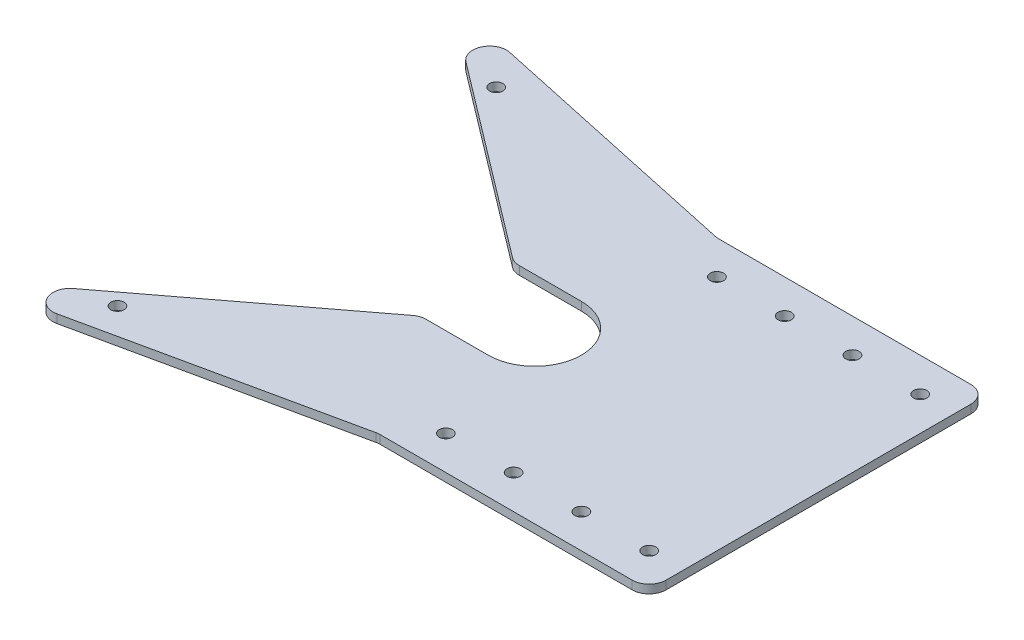
ISO-10303-21;
HEADER;
FILE_DESCRIPTION(('STEP AP214'),'2;1');
FILE_NAME('part.step','',(''),(''),'','','');
FILE_SCHEMA(('AUTOMOTIVE_DESIGN { 1 0 10303 214 1 1 1 1 }'));
ENDSEC;
DATA;
#1=APPLICATION_CONTEXT('core data for automotive mechanical design processes');
#2=APPLICATION_PROTOCOL_DEFINITION('international standard','automotive_design',2000,#1);
#3=PRODUCT_CONTEXT('',#1,'mechanical');
#4=PRODUCT('Part','Part','',(#3));
#5=PRODUCT_RELATED_PRODUCT_CATEGORY('part','',(#4));
#6=PRODUCT_DEFINITION_FORMATION('','',#4);
#7=PRODUCT_DEFINITION_CONTEXT('part definition',#1,'design');
#8=PRODUCT_DEFINITION('design','',#6,#7);
#9=PRODUCT_DEFINITION_SHAPE('','',#8);
#10=(LENGTH_UNIT() NAMED_UNIT(*) SI_UNIT(.MILLI.,.METRE.));
#11=(NAMED_UNIT(*) PLANE_ANGLE_UNIT() SI_UNIT($,.RADIAN.));
#12=(NAMED_UNIT(*) SI_UNIT($,.STERADIAN.) SOLID_ANGLE_UNIT());
#13=UNCERTAINTY_MEASURE_WITH_UNIT(LENGTH_MEASURE(1.E-05),#10,'distance_accuracy_value','');
#14=(GEOMETRIC_REPRESENTATION_CONTEXT(3) GLOBAL_UNCERTAINTY_ASSIGNED_CONTEXT((#13)) GLOBAL_UNIT_ASSIGNED_CONTEXT((#10,
#11,#12)) REPRESENTATION_CONTEXT('',''));
#15=CARTESIAN_POINT('',(0.,0.,0.));
#16=DIRECTION('',(0.,0.,1.));
#17=DIRECTION('',(1.,0.,0.));
#18=AXIS2_PLACEMENT_3D('',#15,#16,#17);
#19=CARTESIAN_POINT('',(-62.8226534491491,3.175,-133.35000000001));
#20=DIRECTION('',(0.,1.,0.));
#21=DIRECTION('',(0.,0.,1.));
#22=AXIS2_PLACEMENT_3D('',#19,#20,#21);
#23=PLANE('',#22);
#24=CARTESIAN_POINT('',(0.,3.175,-114.300000000012));
#25=DIRECTION('',(0.,1.,0.));
#26=DIRECTION('',(0.,0.,1.));
#27=AXIS2_PLACEMENT_3D('',#24,#25,#26);
#28=CIRCLE('',#27,2.48920000000326);
#29=CARTESIAN_POINT('',(0.,3.175,-111.810800000009));
#30=VERTEX_POINT('',#29);
#31=EDGE_CURVE('E403',#30,#30,#28,.T.);
#32=ORIENTED_EDGE('',*,*,#31,.F.);
#33=EDGE_LOOP('',(#32));
#34=FACE_BOUND('',#33,.T.);
#35=CARTESIAN_POINT('',(25.3999999999999,3.175,-12.7000000000122));
#36=DIRECTION('',(0.,1.,0.));
#37=DIRECTION('',(0.,0.,1.));
#38=AXIS2_PLACEMENT_3D('',#35,#36,#37);
#39=CIRCLE('',#38,2.4892);
#40=CARTESIAN_POINT('',(25.3999999999999,3.175,-10.2108000000122));
#41=VERTEX_POINT('',#40);
#42=EDGE_CURVE('E415',#41,#41,#39,.T.);
#43=ORIENTED_EDGE('',*,*,#42,.F.);
#44=EDGE_LOOP('',(#43));
#45=FACE_BOUND('',#44,.T.);
#46=CARTESIAN_POINT('',(-25.4000000000001,3.175,-12.7000000000122));
#47=DIRECTION('',(0.,1.,0.));
#48=DIRECTION('',(0.,0.,1.));
#49=AXIS2_PLACEMENT_3D('',#46,#47,#48);
#50=CIRCLE('',#49,2.4892);
#51=CARTESIAN_POINT('',(-25.4000000000001,3.175,-10.2108000000122));
#52=VERTEX_POINT('',#51);
#53=EDGE_CURVE('E427',#52,#52,#50,.T.);
#54=ORIENTED_EDGE('',*,*,#53,.F.);
#55=EDGE_LOOP('',(#54));
#56=FACE_BOUND('',#55,.T.);
#57=CARTESIAN_POINT('',(-50.8000000000001,3.175,-12.7000000000122));
#58=DIRECTION('',(0.,1.,0.));
#59=DIRECTION('',(0.,0.,1.));
#60=AXIS2_PLACEMENT_3D('',#57,#58,#59);
#61=CIRCLE('',#60,2.48919999999643);
#62=CARTESIAN_POINT('',(-50.8000000000001,3.175,-10.2108000000158));
#63=VERTEX_POINT('',#62);
#64=EDGE_CURVE('E439',#63,#63,#61,.T.);
#65=ORIENTED_EDGE('',*,*,#64,.F.);
#66=EDGE_LOOP('',(#65));
#67=FACE_BOUND('',#66,.T.);
#68=CARTESIAN_POINT('',(-153.721960951708,3.175,7.4822889917496));
#69=DIRECTION('',(0.,1.,0.));
#70=DIRECTION('',(0.,0.,1.));
#71=AXIS2_PLACEMENT_3D('',#68,#69,#70);
#72=CIRCLE('',#71,2.48920000000251);
#73=CARTESIAN_POINT('',(-153.721960951708,3.175,9.97148899175212));
#74=VERTEX_POINT('',#73);
#75=EDGE_CURVE('E204',#74,#74,#72,.T.);
#76=ORIENTED_EDGE('',*,*,#75,.F.);
#77=EDGE_LOOP('',(#76));
#78=FACE_BOUND('',#77,.T.);
#79=CARTESIAN_POINT('',(-62.8226534491491,3.175,-133.35000000001));
#80=DIRECTION('',(0.,-1.,0.));
#81=DIRECTION('',(0.,0.,1.));
#82=AXIS2_PLACEMENT_3D('',#79,#80,#81);
#83=CIRCLE('',#82,6.34999999999883);
#84=CARTESIAN_POINT('',(-62.8226534491471,3.175,-127.000000000012));
#85=VERTEX_POINT('',#84);
#86=CARTESIAN_POINT('',(-64.162105963014,3.175,-127.142877722893));
#87=VERTEX_POINT('',#86);
#88=EDGE_CURVE('E235',#85,#87,#83,.T.);
#89=ORIENTED_EDGE('',*,*,#88,.T.);
#90=DIRECTION('',(-0.977499571199766,0.,-0.210937403758255));
#91=VECTOR('',#90,1.);
#92=CARTESIAN_POINT('',(-64.162105963014,3.175,-127.142877722893));
#93=LINE('',#92,#91);
#94=CARTESIAN_POINT('',(-162.501480761333,3.175,-148.363810210574));
#95=VERTEX_POINT('',#94);
#96=EDGE_CURVE('E133',#87,#95,#93,.T.);
#97=ORIENTED_EDGE('',*,*,#96,.T.);
#98=CARTESIAN_POINT('',(-163.840933275197,3.175,-142.156687933455));
#99=DIRECTION('',(0.,1.,0.));
#100=DIRECTION('',(0.,0.,1.));
#101=AXIS2_PLACEMENT_3D('',#98,#99,#100);
#102=CIRCLE('',#101,6.35000000000025);
#103=CARTESIAN_POINT('',(-167.678132746048,3.175,-137.097201771708));
#104=VERTEX_POINT('',#103);
#105=EDGE_CURVE('E280',#95,#104,#102,.T.);
#106=ORIENTED_EDGE('',*,*,#105,.T.);
#107=DIRECTION('',(0.796769474290929,0.,0.604283381236119));
#108=VECTOR('',#107,1.);
#109=CARTESIAN_POINT('',(-167.678132746048,3.175,-137.097201771708));
#110=LINE('',#109,#108);
#111=CARTESIAN_POINT('',(-95.3640891292027,3.175,-82.2530138382641));
#112=VERTEX_POINT('',#111);
#113=EDGE_CURVE('E299',#104,#112,#110,.T.);
#114=ORIENTED_EDGE('',*,*,#113,.T.);
#115=CARTESIAN_POINT('',(-91.5268896583537,3.175,-87.3125000000104));
#116=DIRECTION('',(0.,1.,0.));
#117=DIRECTION('',(0.,0.,1.));
#118=AXIS2_PLACEMENT_3D('',#115,#116,#117);
#119=CIRCLE('',#118,6.3499999999989);
#120=CARTESIAN_POINT('',(-91.5268896583537,3.175,-80.9625000000115));
#121=VERTEX_POINT('',#120);
#122=EDGE_CURVE('E296',#112,#121,#119,.T.);
#123=ORIENTED_EDGE('',*,*,#122,.T.);
#124=DIRECTION('',(1.,0.,0.));
#125=VECTOR('',#124,1.);
#126=CARTESIAN_POINT('',(-68.2625000000001,3.175,-80.9625000000104));
#127=LINE('',#126,#125);
#128=CARTESIAN_POINT('',(-68.2625000000001,3.175,-80.9625000000104));
#129=VERTEX_POINT('',#128);
#130=EDGE_CURVE('E298',#121,#129,#127,.T.);
#131=ORIENTED_EDGE('',*,*,#130,.T.);
#132=CARTESIAN_POINT('',(-68.2625,3.175,-63.5000000000104));
#133=DIRECTION('',(0.,-1.,0.));
#134=DIRECTION('',(0.,0.,1.));
#135=AXIS2_PLACEMENT_3D('',#132,#133,#134);
#136=CIRCLE('',#135,17.4625);
#137=CARTESIAN_POINT('',(-68.2625000000001,3.175,-46.0375000000104));
#138=VERTEX_POINT('',#137);
#139=EDGE_CURVE('E301',#129,#138,#136,.T.);
#140=ORIENTED_EDGE('',*,*,#139,.T.);
#141=DIRECTION('',(-1.,0.,0.));
#142=VECTOR('',#141,1.);
#143=CARTESIAN_POINT('',(-68.2625000000001,3.175,-46.0375000000104));
#144=LINE('',#143,#142);
#145=CARTESIAN_POINT('',(-91.5268896583538,3.175,-46.0375000000104));
#146=VERTEX_POINT('',#145);
#147=EDGE_CURVE('E307',#138,#146,#144,.T.);
#148=ORIENTED_EDGE('',*,*,#147,.T.);
#149=CARTESIAN_POINT('',(-91.5268896583538,3.175,-39.6875000000104));
#150=DIRECTION('',(0.,1.,0.));
#151=DIRECTION('',(0.,0.,1.));
#152=AXIS2_PLACEMENT_3D('',#149,#150,#151);
#153=CIRCLE('',#152,6.35);
#154=CARTESIAN_POINT('',(-95.3640891292053,3.175,-44.7469861617562));
#155=VERTEX_POINT('',#154);
#156=EDGE_CURVE('E309',#146,#155,#153,.T.);
#157=ORIENTED_EDGE('',*,*,#156,.T.);
#158=DIRECTION('',(-0.796769474290676,0.,0.604283381236453));
#159=VECTOR('',#158,1.);
#160=CARTESIAN_POINT('',(-167.678132746045,3.175,10.097201771732));
#161=LINE('',#160,#159);
#162=CARTESIAN_POINT('',(-167.678132746045,3.175,10.097201771732));
#163=VERTEX_POINT('',#162);
#164=EDGE_CURVE('E311',#155,#163,#161,.T.);
#165=ORIENTED_EDGE('',*,*,#164,.T.);
#166=CARTESIAN_POINT('',(-163.840933275194,3.175,15.1566879334778));
#167=DIRECTION('',(0.,1.,0.));
#168=DIRECTION('',(0.,0.,1.));
#169=AXIS2_PLACEMENT_3D('',#166,#167,#168);
#170=CIRCLE('',#169,6.35);
#171=CARTESIAN_POINT('',(-162.501480761326,3.175,21.3638102105957));
#172=VERTEX_POINT('',#171);
#173=EDGE_CURVE('E313',#163,#172,#170,.T.);
#174=ORIENTED_EDGE('',*,*,#173,.T.);
#175=DIRECTION('',(0.977499571199678,0.,-0.210937403758664));
#176=VECTOR('',#175,1.);
#177=CARTESIAN_POINT('',(-64.1621059630072,3.175,0.142877722871665));
#178=LINE('',#177,#176);
#179=CARTESIAN_POINT('',(-64.1621059630072,3.175,0.142877722871665));
#180=VERTEX_POINT('',#179);
#181=EDGE_CURVE('E315',#172,#180,#178,.T.);
#182=ORIENTED_EDGE('',*,*,#181,.T.);
#183=CARTESIAN_POINT('',(-62.8226534491397,3.175,6.34999999998962));
#184=DIRECTION('',(0.,-1.,0.));
#185=DIRECTION('',(0.,0.,1.));
#186=AXIS2_PLACEMENT_3D('',#183,#184,#185);
#187=CIRCLE('',#186,6.35);
#188=CARTESIAN_POINT('',(-62.8226534491397,3.175,-1.03814526419832E-11));
#189=VERTEX_POINT('',#188);
#190=EDGE_CURVE('E317',#180,#189,#187,.T.);
#191=ORIENTED_EDGE('',*,*,#190,.T.);
#192=DIRECTION('',(1.,0.,0.));
#193=VECTOR('',#192,1.);
#194=CARTESIAN_POINT('',(31.7499999999999,3.175,-1.22462803786583E-11));
#195=LINE('',#194,#193);
#196=CARTESIAN_POINT('',(31.7499999999999,3.175,-1.22462803786583E-11));
#197=VERTEX_POINT('',#196);
#198=EDGE_CURVE('E319',#189,#197,#195,.T.);
#199=ORIENTED_EDGE('',*,*,#198,.T.);
#200=CARTESIAN_POINT('',(31.7499999999999,3.175,-6.35000000001225));
#201=DIRECTION('',(0.,1.,0.));
#202=DIRECTION('',(0.,0.,1.));
#203=AXIS2_PLACEMENT_3D('',#200,#201,#202);
#204=CIRCLE('',#203,6.35);
#205=CARTESIAN_POINT('',(38.0999999999999,3.175,-6.35000000001225));
#206=VERTEX_POINT('',#205);
#207=EDGE_CURVE('E182',#197,#206,#204,.T.);
#208=ORIENTED_EDGE('',*,*,#207,.T.);
#209=DIRECTION('',(0.,0.,-1.));
#210=VECTOR('',#209,1.);
#211=CARTESIAN_POINT('',(38.0999999999999,3.175,-6.35000000001225));
#212=LINE('',#211,#210);
#213=CARTESIAN_POINT('',(38.0999999999999,3.175,-120.650000000012));
#214=VERTEX_POINT('',#213);
#215=EDGE_CURVE('E176',#206,#214,#212,.T.);
#216=ORIENTED_EDGE('',*,*,#215,.T.);
#217=CARTESIAN_POINT('',(31.7499999999999,3.175,-120.650000000012));
#218=DIRECTION('',(0.,1.,0.));
#219=DIRECTION('',(0.,0.,1.));
#220=AXIS2_PLACEMENT_3D('',#217,#218,#219);
#221=CIRCLE('',#220,6.35);
#222=CARTESIAN_POINT('',(31.7499999999999,3.175,-127.000000000012));
#223=VERTEX_POINT('',#222);
#224=EDGE_CURVE('E180',#214,#223,#221,.T.);
#225=ORIENTED_EDGE('',*,*,#224,.T.);
#226=DIRECTION('',(-1.,0.,0.));
#227=VECTOR('',#226,1.);
#228=CARTESIAN_POINT('',(31.7499999999999,3.175,-127.000000000012));
#229=LINE('',#228,#227);
#230=EDGE_CURVE('E60',#223,#85,#229,.T.);
#231=ORIENTED_EDGE('',*,*,#230,.T.);
#232=EDGE_LOOP('',(#89,#97,#106,#114,#123,#131,#140,#148,#157,#165,#174,#182,#191,#199,#208,
#216,#225,#231));
#233=FACE_BOUND('',#232,.T.);
#234=CARTESIAN_POINT('',(-153.721960951708,3.175,-134.48228899175));
#235=DIRECTION('',(0.,1.,0.));
#236=DIRECTION('',(0.,0.,1.));
#237=AXIS2_PLACEMENT_3D('',#234,#235,#236);
#238=CIRCLE('',#237,2.48920000000588);
#239=CARTESIAN_POINT('',(-153.721960951708,3.175,-131.993088991744));
#240=VERTEX_POINT('',#239);
#241=EDGE_CURVE('E445',#240,#240,#238,.T.);
#242=ORIENTED_EDGE('',*,*,#241,.F.);
#243=EDGE_LOOP('',(#242));
#244=FACE_BOUND('',#243,.T.);
#245=CARTESIAN_POINT('',(-50.8000000000001,3.175,-114.300000000012));
#246=DIRECTION('',(0.,1.,0.));
#247=DIRECTION('',(0.,0.,1.));
#248=AXIS2_PLACEMENT_3D('',#245,#246,#247);
#249=CIRCLE('',#248,2.48919999999644);
#250=CARTESIAN_POINT('',(-50.8000000000001,3.175,-111.810800000016));
#251=VERTEX_POINT('',#250);
#252=EDGE_CURVE('E433',#251,#251,#249,.T.);
#253=ORIENTED_EDGE('',*,*,#252,.F.);
#254=EDGE_LOOP('',(#253));
#255=FACE_BOUND('',#254,.T.);
#256=CARTESIAN_POINT('',(0.,3.175,-12.7000000000122));
#257=DIRECTION('',(0.,1.,0.));
#258=DIRECTION('',(0.,0.,1.));
#259=AXIS2_PLACEMENT_3D('',#256,#257,#258);
#260=CIRCLE('',#259,2.4892);
#261=CARTESIAN_POINT('',(0.,3.175,-10.2108000000122));
#262=VERTEX_POINT('',#261);
#263=EDGE_CURVE('E421',#262,#262,#260,.T.);
#264=ORIENTED_EDGE('',*,*,#263,.F.);
#265=EDGE_LOOP('',(#264));
#266=FACE_BOUND('',#265,.T.);
#267=CARTESIAN_POINT('',(25.3999999999999,3.175,-114.300000000012));
#268=DIRECTION('',(0.,1.,0.));
#269=DIRECTION('',(0.,0.,1.));
#270=AXIS2_PLACEMENT_3D('',#267,#268,#269);
#271=CIRCLE('',#270,2.48920000000326);
#272=CARTESIAN_POINT('',(25.3999999999999,3.175,-111.810800000009));
#273=VERTEX_POINT('',#272);
#274=EDGE_CURVE('E409',#273,#273,#271,.T.);
#275=ORIENTED_EDGE('',*,*,#274,.F.);
#276=EDGE_LOOP('',(#275));
#277=FACE_BOUND('',#276,.T.);
#278=CARTESIAN_POINT('',(-25.4000000000001,3.175,-114.300000000012));
#279=DIRECTION('',(0.,1.,0.));
#280=DIRECTION('',(0.,0.,1.));
#281=AXIS2_PLACEMENT_3D('',#278,#279,#280);
#282=CIRCLE('',#281,2.48920000000326);
#283=CARTESIAN_POINT('',(-25.4000000000001,3.175,-111.810800000009));
#284=VERTEX_POINT('',#283);
#285=EDGE_CURVE('E394',#284,#284,#282,.T.);
#286=ORIENTED_EDGE('',*,*,#285,.F.);
#287=EDGE_LOOP('',(#286));
#288=FACE_BOUND('',#287,.T.);
#289=ADVANCED_FACE('F43',(#34,#45,#56,#67,#78,#233,#244,#255,#266,#277,#288),#23,.T.);
#290=CARTESIAN_POINT('',(-62.8226534491491,0.,-133.35000000001));
#291=DIRECTION('',(0.,1.,0.));
#292=DIRECTION('',(0.,0.,1.));
#293=AXIS2_PLACEMENT_3D('',#290,#291,#292);
#294=PLANE('',#293);
#295=CARTESIAN_POINT('',(-62.8226534491491,0.,-133.35000000001));
#296=DIRECTION('',(0.,-1.,0.));
#297=DIRECTION('',(0.,0.,1.));
#298=AXIS2_PLACEMENT_3D('',#295,#296,#297);
#299=CIRCLE('',#298,6.34999999999883);
#300=CARTESIAN_POINT('',(-62.8226534491471,0.,-127.000000000012));
#301=VERTEX_POINT('',#300);
#302=CARTESIAN_POINT('',(-64.162105963014,0.,-127.142877722893));
#303=VERTEX_POINT('',#302);
#304=EDGE_CURVE('E200',#301,#303,#299,.T.);
#305=ORIENTED_EDGE('',*,*,#304,.F.);
#306=DIRECTION('',(-1.,0.,0.));
#307=VECTOR('',#306,1.);
#308=CARTESIAN_POINT('',(31.7499999999999,0.,-127.000000000012));
#309=LINE('',#308,#307);
#310=CARTESIAN_POINT('',(31.7499999999999,0.,-127.000000000012));
#311=VERTEX_POINT('',#310);
#312=EDGE_CURVE('E125',#311,#301,#309,.T.);
#313=ORIENTED_EDGE('',*,*,#312,.F.);
#314=CARTESIAN_POINT('',(31.7499999999999,0.,-120.650000000012));
#315=DIRECTION('',(0.,1.,0.));
#316=DIRECTION('',(0.,0.,1.));
#317=AXIS2_PLACEMENT_3D('',#314,#315,#316);
#318=CIRCLE('',#317,6.35);
#319=CARTESIAN_POINT('',(38.0999999999999,0.,-120.650000000012));
#320=VERTEX_POINT('',#319);
#321=EDGE_CURVE('E119',#320,#311,#318,.T.);
#322=ORIENTED_EDGE('',*,*,#321,.F.);
#323=DIRECTION('',(0.,0.,-1.));
#324=VECTOR('',#323,1.);
#325=CARTESIAN_POINT('',(38.0999999999999,0.,-6.35000000001225));
#326=LINE('',#325,#324);
#327=CARTESIAN_POINT('',(38.0999999999999,0.,-6.35000000001225));
#328=VERTEX_POINT('',#327);
#329=EDGE_CURVE('E190',#328,#320,#326,.T.);
#330=ORIENTED_EDGE('',*,*,#329,.F.);
#331=CARTESIAN_POINT('',(31.7499999999999,0.,-6.35000000001225));
#332=DIRECTION('',(0.,1.,0.));
#333=DIRECTION('',(0.,0.,1.));
#334=AXIS2_PLACEMENT_3D('',#331,#332,#333);
#335=CIRCLE('',#334,6.35);
#336=CARTESIAN_POINT('',(31.7499999999999,0.,-1.22462803786583E-11));
#337=VERTEX_POINT('',#336);
#338=EDGE_CURVE('E230',#337,#328,#335,.T.);
#339=ORIENTED_EDGE('',*,*,#338,.F.);
#340=DIRECTION('',(1.,0.,0.));
#341=VECTOR('',#340,1.);
#342=CARTESIAN_POINT('',(31.7499999999999,0.,-1.22462803786583E-11));
#343=LINE('',#342,#341);
#344=CARTESIAN_POINT('',(-62.8226534491397,0.,-1.03814526419832E-11));
#345=VERTEX_POINT('',#344);
#346=EDGE_CURVE('E228',#345,#337,#343,.T.);
#347=ORIENTED_EDGE('',*,*,#346,.F.);
#348=CARTESIAN_POINT('',(-62.8226534491397,0.,6.34999999998962));
#349=DIRECTION('',(0.,-1.,0.));
#350=DIRECTION('',(0.,0.,1.));
#351=AXIS2_PLACEMENT_3D('',#348,#349,#350);
#352=CIRCLE('',#351,6.35);
#353=CARTESIAN_POINT('',(-64.1621059630072,0.,0.142877722871665));
#354=VERTEX_POINT('',#353);
#355=EDGE_CURVE('E226',#354,#345,#352,.T.);
#356=ORIENTED_EDGE('',*,*,#355,.F.);
#357=DIRECTION('',(0.977499571199678,0.,-0.210937403758664));
#358=VECTOR('',#357,1.);
#359=CARTESIAN_POINT('',(-64.1621059630072,0.,0.142877722871665));
#360=LINE('',#359,#358);
#361=CARTESIAN_POINT('',(-162.501480761326,0.,21.3638102105957));
#362=VERTEX_POINT('',#361);
#363=EDGE_CURVE('E224',#362,#354,#360,.T.);
#364=ORIENTED_EDGE('',*,*,#363,.F.);
#365=CARTESIAN_POINT('',(-163.840933275194,0.,15.1566879334778));
#366=DIRECTION('',(0.,1.,0.));
#367=DIRECTION('',(0.,0.,1.));
#368=AXIS2_PLACEMENT_3D('',#365,#366,#367);
#369=CIRCLE('',#368,6.35);
#370=CARTESIAN_POINT('',(-167.678132746045,0.,10.097201771732));
#371=VERTEX_POINT('',#370);
#372=EDGE_CURVE('E222',#371,#362,#369,.T.);
#373=ORIENTED_EDGE('',*,*,#372,.F.);
#374=DIRECTION('',(-0.796769474290676,0.,0.604283381236453));
#375=VECTOR('',#374,1.);
#376=CARTESIAN_POINT('',(-167.678132746045,0.,10.097201771732));
#377=LINE('',#376,#375);
#378=CARTESIAN_POINT('',(-95.3640891292053,0.,-44.7469861617562));
#379=VERTEX_POINT('',#378);
#380=EDGE_CURVE('E220',#379,#371,#377,.T.);
#381=ORIENTED_EDGE('',*,*,#380,.F.);
#382=CARTESIAN_POINT('',(-91.5268896583538,0.,-39.6875000000104));
#383=DIRECTION('',(0.,1.,0.));
#384=DIRECTION('',(0.,0.,1.));
#385=AXIS2_PLACEMENT_3D('',#382,#383,#384);
#386=CIRCLE('',#385,6.35);
#387=CARTESIAN_POINT('',(-91.5268896583538,0.,-46.0375000000104));
#388=VERTEX_POINT('',#387);
#389=EDGE_CURVE('E218',#388,#379,#386,.T.);
#390=ORIENTED_EDGE('',*,*,#389,.F.);
#391=DIRECTION('',(-1.,0.,0.));
#392=VECTOR('',#391,1.);
#393=CARTESIAN_POINT('',(-68.2625000000001,0.,-46.0375000000104));
#394=LINE('',#393,#392);
#395=CARTESIAN_POINT('',(-68.2625000000001,0.,-46.0375000000104));
#396=VERTEX_POINT('',#395);
#397=EDGE_CURVE('E216',#396,#388,#394,.T.);
#398=ORIENTED_EDGE('',*,*,#397,.F.);
#399=CARTESIAN_POINT('',(-68.2625,0.,-63.5000000000104));
#400=DIRECTION('',(0.,-1.,0.));
#401=DIRECTION('',(0.,0.,1.));
#402=AXIS2_PLACEMENT_3D('',#399,#400,#401);
#403=CIRCLE('',#402,17.4625);
#404=CARTESIAN_POINT('',(-68.2625000000001,0.,-80.9625000000104));
#405=VERTEX_POINT('',#404);
#406=EDGE_CURVE('E214',#405,#396,#403,.T.);
#407=ORIENTED_EDGE('',*,*,#406,.F.);
#408=DIRECTION('',(1.,0.,0.));
#409=VECTOR('',#408,1.);
#410=CARTESIAN_POINT('',(-68.2625000000001,0.,-80.9625000000104));
#411=LINE('',#410,#409);
#412=CARTESIAN_POINT('',(-91.5268896583537,0.,-80.9625000000115));
#413=VERTEX_POINT('',#412);
#414=EDGE_CURVE('E212',#413,#405,#411,.T.);
#415=ORIENTED_EDGE('',*,*,#414,.F.);
#416=CARTESIAN_POINT('',(-91.5268896583537,0.,-87.3125000000104));
#417=DIRECTION('',(0.,1.,0.));
#418=DIRECTION('',(0.,0.,1.));
#419=AXIS2_PLACEMENT_3D('',#416,#417,#418);
#420=CIRCLE('',#419,6.3499999999989);
#421=CARTESIAN_POINT('',(-95.3640891292027,0.,-82.2530138382641));
#422=VERTEX_POINT('',#421);
#423=EDGE_CURVE('E210',#422,#413,#420,.T.);
#424=ORIENTED_EDGE('',*,*,#423,.F.);
#425=DIRECTION('',(0.796769474290929,0.,0.604283381236119));
#426=VECTOR('',#425,1.);
#427=CARTESIAN_POINT('',(-167.678132746048,0.,-137.097201771708));
#428=LINE('',#427,#426);
#429=CARTESIAN_POINT('',(-167.678132746048,0.,-137.097201771708));
#430=VERTEX_POINT('',#429);
#431=EDGE_CURVE('E208',#430,#422,#428,.T.);
#432=ORIENTED_EDGE('',*,*,#431,.F.);
#433=CARTESIAN_POINT('',(-163.840933275197,0.,-142.156687933455));
#434=DIRECTION('',(0.,1.,0.));
#435=DIRECTION('',(0.,0.,1.));
#436=AXIS2_PLACEMENT_3D('',#433,#434,#435);
#437=CIRCLE('',#436,6.35000000000025);
#438=CARTESIAN_POINT('',(-162.501480761333,0.,-148.363810210574));
#439=VERTEX_POINT('',#438);
#440=EDGE_CURVE('E206',#439,#430,#437,.T.);
#441=ORIENTED_EDGE('',*,*,#440,.F.);
#442=DIRECTION('',(-0.977499571199766,0.,-0.210937403758255));
#443=VECTOR('',#442,1.);
#444=CARTESIAN_POINT('',(-64.162105963014,0.,-127.142877722893));
#445=LINE('',#444,#443);
#446=EDGE_CURVE('E203',#303,#439,#445,.T.);
#447=ORIENTED_EDGE('',*,*,#446,.F.);
#448=EDGE_LOOP('',(#305,#313,#322,#330,#339,#347,#356,#364,#373,#381,#390,#398,#407,#415,#424,
#432,#441,#447));
#449=FACE_BOUND('',#448,.T.);
#450=CARTESIAN_POINT('',(-153.721960951708,0.,7.4822889917496));
#451=DIRECTION('',(0.,1.,0.));
#452=DIRECTION('',(0.,0.,1.));
#453=AXIS2_PLACEMENT_3D('',#450,#451,#452);
#454=CIRCLE('',#453,2.48920000000251);
#455=CARTESIAN_POINT('',(-153.721960951708,0.,9.97148899175212));
#456=VERTEX_POINT('',#455);
#457=EDGE_CURVE('E448',#456,#456,#454,.T.);
#458=ORIENTED_EDGE('',*,*,#457,.T.);
#459=EDGE_LOOP('',(#458));
#460=FACE_BOUND('',#459,.T.);
#461=CARTESIAN_POINT('',(-153.721960951708,0.,-134.48228899175));
#462=DIRECTION('',(0.,1.,0.));
#463=DIRECTION('',(0.,0.,1.));
#464=AXIS2_PLACEMENT_3D('',#461,#462,#463);
#465=CIRCLE('',#464,2.48920000000588);
#466=CARTESIAN_POINT('',(-153.721960951708,0.,-131.993088991744));
#467=VERTEX_POINT('',#466);
#468=EDGE_CURVE('E442',#467,#467,#465,.T.);
#469=ORIENTED_EDGE('',*,*,#468,.T.);
#470=EDGE_LOOP('',(#469));
#471=FACE_BOUND('',#470,.T.);
#472=CARTESIAN_POINT('',(-50.8000000000001,0.,-12.7000000000122));
#473=DIRECTION('',(0.,1.,0.));
#474=DIRECTION('',(0.,0.,1.));
#475=AXIS2_PLACEMENT_3D('',#472,#473,#474);
#476=CIRCLE('',#475,2.48919999999643);
#477=CARTESIAN_POINT('',(-50.8000000000001,0.,-10.2108000000158));
#478=VERTEX_POINT('',#477);
#479=EDGE_CURVE('E436',#478,#478,#476,.T.);
#480=ORIENTED_EDGE('',*,*,#479,.T.);
#481=EDGE_LOOP('',(#480));
#482=FACE_BOUND('',#481,.T.);
#483=CARTESIAN_POINT('',(-50.8000000000001,0.,-114.300000000012));
#484=DIRECTION('',(0.,1.,0.));
#485=DIRECTION('',(0.,0.,1.));
#486=AXIS2_PLACEMENT_3D('',#483,#484,#485);
#487=CIRCLE('',#486,2.48919999999644);
#488=CARTESIAN_POINT('',(-50.8000000000001,0.,-111.810800000016));
#489=VERTEX_POINT('',#488);
#490=EDGE_CURVE('E430',#489,#489,#487,.T.);
#491=ORIENTED_EDGE('',*,*,#490,.T.);
#492=EDGE_LOOP('',(#491));
#493=FACE_BOUND('',#492,.T.);
#494=CARTESIAN_POINT('',(-25.4000000000001,0.,-12.7000000000122));
#495=DIRECTION('',(0.,1.,0.));
#496=DIRECTION('',(0.,0.,1.));
#497=AXIS2_PLACEMENT_3D('',#494,#495,#496);
#498=CIRCLE('',#497,2.4892);
#499=CARTESIAN_POINT('',(-25.4000000000001,0.,-10.2108000000122));
#500=VERTEX_POINT('',#499);
#501=EDGE_CURVE('E424',#500,#500,#498,.T.);
#502=ORIENTED_EDGE('',*,*,#501,.T.);
#503=EDGE_LOOP('',(#502));
#504=FACE_BOUND('',#503,.T.);
#505=CARTESIAN_POINT('',(0.,0.,-12.7000000000122));
#506=DIRECTION('',(0.,1.,0.));
#507=DIRECTION('',(0.,0.,1.));
#508=AXIS2_PLACEMENT_3D('',#505,#506,#507);
#509=CIRCLE('',#508,2.4892);
#510=CARTESIAN_POINT('',(0.,0.,-10.2108000000122));
#511=VERTEX_POINT('',#510);
#512=EDGE_CURVE('E418',#511,#511,#509,.T.);
#513=ORIENTED_EDGE('',*,*,#512,.T.);
#514=EDGE_LOOP('',(#513));
#515=FACE_BOUND('',#514,.T.);
#516=CARTESIAN_POINT('',(25.3999999999999,0.,-12.7000000000122));
#517=DIRECTION('',(0.,1.,0.));
#518=DIRECTION('',(0.,0.,1.));
#519=AXIS2_PLACEMENT_3D('',#516,#517,#518);
#520=CIRCLE('',#519,2.4892);
#521=CARTESIAN_POINT('',(25.3999999999999,0.,-10.2108000000122));
#522=VERTEX_POINT('',#521);
#523=EDGE_CURVE('E412',#522,#522,#520,.T.);
#524=ORIENTED_EDGE('',*,*,#523,.T.);
#525=EDGE_LOOP('',(#524));
#526=FACE_BOUND('',#525,.T.);
#527=CARTESIAN_POINT('',(25.3999999999999,0.,-114.300000000012));
#528=DIRECTION('',(0.,1.,0.));
#529=DIRECTION('',(0.,0.,1.));
#530=AXIS2_PLACEMENT_3D('',#527,#528,#529);
#531=CIRCLE('',#530,2.48920000000326);
#532=CARTESIAN_POINT('',(25.3999999999999,0.,-111.810800000009));
#533=VERTEX_POINT('',#532);
#534=EDGE_CURVE('E406',#533,#533,#531,.T.);
#535=ORIENTED_EDGE('',*,*,#534,.T.);
#536=EDGE_LOOP('',(#535));
#537=FACE_BOUND('',#536,.T.);
#538=CARTESIAN_POINT('',(0.,0.,-114.300000000012));
#539=DIRECTION('',(0.,1.,0.));
#540=DIRECTION('',(0.,0.,1.));
#541=AXIS2_PLACEMENT_3D('',#538,#539,#540);
#542=CIRCLE('',#541,2.48920000000326);
#543=CARTESIAN_POINT('',(0.,0.,-111.810800000009));
#544=VERTEX_POINT('',#543);
#545=EDGE_CURVE('E400',#544,#544,#542,.T.);
#546=ORIENTED_EDGE('',*,*,#545,.T.);
#547=EDGE_LOOP('',(#546));
#548=FACE_BOUND('',#547,.T.);
#549=CARTESIAN_POINT('',(-25.4000000000001,0.,-114.300000000012));
#550=DIRECTION('',(0.,1.,0.));
#551=DIRECTION('',(0.,0.,1.));
#552=AXIS2_PLACEMENT_3D('',#549,#550,#551);
#553=CIRCLE('',#552,2.48920000000326);
#554=CARTESIAN_POINT('',(-25.4000000000001,0.,-111.810800000009));
#555=VERTEX_POINT('',#554);
#556=EDGE_CURVE('E397',#555,#555,#553,.T.);
#557=ORIENTED_EDGE('',*,*,#556,.T.);
#558=EDGE_LOOP('',(#557));
#559=FACE_BOUND('',#558,.T.);
#560=ADVANCED_FACE('F284',(#449,#460,#471,#482,#493,#504,#515,#526,#537,#548,#559),#294,.F.);
#561=CARTESIAN_POINT('',(-62.8226534491491,3.175,-133.35000000001));
#562=DIRECTION('',(0.,-1.,0.));
#563=DIRECTION('',(0.,0.,-1.));
#564=AXIS2_PLACEMENT_3D('',#561,#562,#563);
#565=CYLINDRICAL_SURFACE('',#564,6.34999999999883);
#566=ORIENTED_EDGE('',*,*,#304,.T.);
#567=DIRECTION('',(0.,-1.,0.));
#568=VECTOR('',#567,1.);
#569=CARTESIAN_POINT('',(-64.162105963014,3.175,-127.142877722893));
#570=LINE('',#569,#568);
#571=EDGE_CURVE('E11',#87,#303,#570,.T.);
#572=ORIENTED_EDGE('',*,*,#571,.F.);
#573=ORIENTED_EDGE('',*,*,#88,.F.);
#574=DIRECTION('',(0.,-1.,0.));
#575=VECTOR('',#574,1.);
#576=CARTESIAN_POINT('',(-62.8226534491471,3.175,-127.000000000012));
#577=LINE('',#576,#575);
#578=EDGE_CURVE('E196',#85,#301,#577,.T.);
#579=ORIENTED_EDGE('',*,*,#578,.T.);
#580=EDGE_LOOP('',(#566,#572,#573,#579));
#581=FACE_BOUND('',#580,.T.);
#582=ADVANCED_FACE('F45',(#581),#565,.F.);
#583=CARTESIAN_POINT('',(-64.162105963014,3.175,-127.142877722893));
#584=DIRECTION('',(-0.210937403758255,0.,0.977499571199766));
#585=DIRECTION('',(0.977499571199766,0.,0.210937403758255));
#586=AXIS2_PLACEMENT_3D('',#583,#584,#585);
#587=PLANE('',#586);
#588=ORIENTED_EDGE('',*,*,#446,.T.);
#589=DIRECTION('',(0.,-1.,0.));
#590=VECTOR('',#589,1.);
#591=CARTESIAN_POINT('',(-162.501480761333,3.175,-148.363810210574));
#592=LINE('',#591,#590);
#593=EDGE_CURVE('E52',#95,#439,#592,.T.);
#594=ORIENTED_EDGE('',*,*,#593,.F.);
#595=ORIENTED_EDGE('',*,*,#96,.F.);
#596=ORIENTED_EDGE('',*,*,#571,.T.);
#597=EDGE_LOOP('',(#588,#594,#595,#596));
#598=FACE_BOUND('',#597,.T.);
#599=ADVANCED_FACE('F682',(#598),#587,.F.);
#600=CARTESIAN_POINT('',(-163.840933275197,3.175,-142.156687933455));
#601=DIRECTION('',(0.,-1.,0.));
#602=DIRECTION('',(0.,0.,-1.));
#603=AXIS2_PLACEMENT_3D('',#600,#601,#602);
#604=CYLINDRICAL_SURFACE('',#603,6.35000000000025);
#605=ORIENTED_EDGE('',*,*,#440,.T.);
#606=DIRECTION('',(0.,-1.,0.));
#607=VECTOR('',#606,1.);
#608=CARTESIAN_POINT('',(-167.678132746048,3.175,-137.097201771708));
#609=LINE('',#608,#607);
#610=EDGE_CURVE('E272',#104,#430,#609,.T.);
#611=ORIENTED_EDGE('',*,*,#610,.F.);
#612=ORIENTED_EDGE('',*,*,#105,.F.);
#613=ORIENTED_EDGE('',*,*,#593,.T.);
#614=EDGE_LOOP('',(#605,#611,#612,#613));
#615=FACE_BOUND('',#614,.T.);
#616=ADVANCED_FACE('F278',(#615),#604,.T.);
#617=CARTESIAN_POINT('',(-167.678132746048,3.175,-137.097201771708));
#618=DIRECTION('',(0.604283381236119,0.,-0.796769474290929));
#619=DIRECTION('',(-0.796769474290929,0.,-0.604283381236119));
#620=AXIS2_PLACEMENT_3D('',#617,#618,#619);
#621=PLANE('',#620);
#622=ORIENTED_EDGE('',*,*,#431,.T.);
#623=DIRECTION('',(0.,-1.,0.));
#624=VECTOR('',#623,1.);
#625=CARTESIAN_POINT('',(-95.3640891292027,3.175,-82.2530138382641));
#626=LINE('',#625,#624);
#627=EDGE_CURVE('E269',#112,#422,#626,.T.);
#628=ORIENTED_EDGE('',*,*,#627,.F.);
#629=ORIENTED_EDGE('',*,*,#113,.F.);
#630=ORIENTED_EDGE('',*,*,#610,.T.);
#631=EDGE_LOOP('',(#622,#628,#629,#630));
#632=FACE_BOUND('',#631,.T.);
#633=ADVANCED_FACE('F290',(#632),#621,.F.);
#634=CARTESIAN_POINT('',(-91.5268896583537,3.175,-87.3125000000104));
#635=DIRECTION('',(0.,-1.,0.));
#636=DIRECTION('',(0.,0.,-1.));
#637=AXIS2_PLACEMENT_3D('',#634,#635,#636);
#638=CYLINDRICAL_SURFACE('',#637,6.3499999999989);
#639=ORIENTED_EDGE('',*,*,#423,.T.);
#640=DIRECTION('',(0.,-1.,0.));
#641=VECTOR('',#640,1.);
#642=CARTESIAN_POINT('',(-91.5268896583537,3.175,-80.9625000000115));
#643=LINE('',#642,#641);
#644=EDGE_CURVE('E266',#121,#413,#643,.T.);
#645=ORIENTED_EDGE('',*,*,#644,.F.);
#646=ORIENTED_EDGE('',*,*,#122,.F.);
#647=ORIENTED_EDGE('',*,*,#627,.T.);
#648=EDGE_LOOP('',(#639,#645,#646,#647));
#649=FACE_BOUND('',#648,.T.);
#650=ADVANCED_FACE('F294',(#649),#638,.T.);
#651=CARTESIAN_POINT('',(-68.2625000000001,3.175,-80.9625000000104));
#652=DIRECTION('',(0.,0.,-1.));
#653=DIRECTION('',(-1.,0.,0.));
#654=AXIS2_PLACEMENT_3D('',#651,#652,#653);
#655=PLANE('',#654);
#656=ORIENTED_EDGE('',*,*,#414,.T.);
#657=DIRECTION('',(0.,-1.,0.));
#658=VECTOR('',#657,1.);
#659=CARTESIAN_POINT('',(-68.2625000000001,3.175,-80.9625000000104));
#660=LINE('',#659,#658);
#661=EDGE_CURVE('E263',#129,#405,#660,.T.);
#662=ORIENTED_EDGE('',*,*,#661,.F.);
#663=ORIENTED_EDGE('',*,*,#130,.F.);
#664=ORIENTED_EDGE('',*,*,#644,.T.);
#665=EDGE_LOOP('',(#656,#662,#663,#664));
#666=FACE_BOUND('',#665,.T.);
#667=ADVANCED_FACE('F647',(#666),#655,.F.);
#668=CARTESIAN_POINT('',(-68.2625,3.175,-63.5000000000104));
#669=DIRECTION('',(0.,-1.,0.));
#670=DIRECTION('',(0.,0.,-1.));
#671=AXIS2_PLACEMENT_3D('',#668,#669,#670);
#672=CYLINDRICAL_SURFACE('',#671,17.4625);
#673=ORIENTED_EDGE('',*,*,#406,.T.);
#674=DIRECTION('',(0.,-1.,0.));
#675=VECTOR('',#674,1.);
#676=CARTESIAN_POINT('',(-68.2625000000001,3.175,-46.0375000000104));
#677=LINE('',#676,#675);
#678=EDGE_CURVE('E260',#138,#396,#677,.T.);
#679=ORIENTED_EDGE('',*,*,#678,.F.);
#680=ORIENTED_EDGE('',*,*,#139,.F.);
#681=ORIENTED_EDGE('',*,*,#661,.T.);
#682=EDGE_LOOP('',(#673,#679,#680,#681));
#683=FACE_BOUND('',#682,.T.);
#684=ADVANCED_FACE('F637',(#683),#672,.F.);
#685=CARTESIAN_POINT('',(-68.2625000000001,3.175,-46.0375000000104));
#686=DIRECTION('',(0.,0.,1.));
#687=DIRECTION('',(1.,0.,0.));
#688=AXIS2_PLACEMENT_3D('',#685,#686,#687);
#689=PLANE('',#688);
#690=ORIENTED_EDGE('',*,*,#397,.T.);
#691=DIRECTION('',(0.,-1.,0.));
#692=VECTOR('',#691,1.);
#693=CARTESIAN_POINT('',(-91.5268896583538,3.175,-46.0375000000104));
#694=LINE('',#693,#692);
#695=EDGE_CURVE('E257',#146,#388,#694,.T.);
#696=ORIENTED_EDGE('',*,*,#695,.F.);
#697=ORIENTED_EDGE('',*,*,#147,.F.);
#698=ORIENTED_EDGE('',*,*,#678,.T.);
#699=EDGE_LOOP('',(#690,#696,#697,#698));
#700=FACE_BOUND('',#699,.T.);
#701=ADVANCED_FACE('F627',(#700),#689,.F.);
#702=CARTESIAN_POINT('',(-91.5268896583538,3.175,-39.6875000000104));
#703=DIRECTION('',(0.,-1.,0.));
#704=DIRECTION('',(0.,0.,-1.));
#705=AXIS2_PLACEMENT_3D('',#702,#703,#704);
#706=CYLINDRICAL_SURFACE('',#705,6.35);
#707=ORIENTED_EDGE('',*,*,#389,.T.);
#708=DIRECTION('',(0.,-1.,0.));
#709=VECTOR('',#708,1.);
#710=CARTESIAN_POINT('',(-95.3640891292053,3.175,-44.7469861617562));
#711=LINE('',#710,#709);
#712=EDGE_CURVE('E254',#155,#379,#711,.T.);
#713=ORIENTED_EDGE('',*,*,#712,.F.);
#714=ORIENTED_EDGE('',*,*,#156,.F.);
#715=ORIENTED_EDGE('',*,*,#695,.T.);
#716=EDGE_LOOP('',(#707,#713,#714,#715));
#717=FACE_BOUND('',#716,.T.);
#718=ADVANCED_FACE('F617',(#717),#706,.T.);
#719=CARTESIAN_POINT('',(-167.678132746045,3.175,10.097201771732));
#720=DIRECTION('',(0.604283381236453,0.,0.796769474290676));
#721=DIRECTION('',(0.796769474290676,0.,-0.604283381236453));
#722=AXIS2_PLACEMENT_3D('',#719,#720,#721);
#723=PLANE('',#722);
#724=ORIENTED_EDGE('',*,*,#380,.T.);
#725=DIRECTION('',(0.,-1.,0.));
#726=VECTOR('',#725,1.);
#727=CARTESIAN_POINT('',(-167.678132746045,3.175,10.097201771732));
#728=LINE('',#727,#726);
#729=EDGE_CURVE('E251',#163,#371,#728,.T.);
#730=ORIENTED_EDGE('',*,*,#729,.F.);
#731=ORIENTED_EDGE('',*,*,#164,.F.);
#732=ORIENTED_EDGE('',*,*,#712,.T.);
#733=EDGE_LOOP('',(#724,#730,#731,#732));
#734=FACE_BOUND('',#733,.T.);
#735=ADVANCED_FACE('F607',(#734),#723,.F.);
#736=CARTESIAN_POINT('',(-163.840933275194,3.175,15.1566879334778));
#737=DIRECTION('',(0.,-1.,0.));
#738=DIRECTION('',(0.,0.,-1.));
#739=AXIS2_PLACEMENT_3D('',#736,#737,#738);
#740=CYLINDRICAL_SURFACE('',#739,6.35);
#741=ORIENTED_EDGE('',*,*,#372,.T.);
#742=DIRECTION('',(0.,-1.,0.));
#743=VECTOR('',#742,1.);
#744=CARTESIAN_POINT('',(-162.501480761326,3.175,21.3638102105957));
#745=LINE('',#744,#743);
#746=EDGE_CURVE('E248',#172,#362,#745,.T.);
#747=ORIENTED_EDGE('',*,*,#746,.F.);
#748=ORIENTED_EDGE('',*,*,#173,.F.);
#749=ORIENTED_EDGE('',*,*,#729,.T.);
#750=EDGE_LOOP('',(#741,#747,#748,#749));
#751=FACE_BOUND('',#750,.T.);
#752=ADVANCED_FACE('F597',(#751),#740,.T.);
#753=CARTESIAN_POINT('',(-64.1621059630072,3.175,0.142877722871665));
#754=DIRECTION('',(-0.210937403758664,0.,-0.977499571199678));
#755=DIRECTION('',(-0.977499571199678,0.,0.210937403758664));
#756=AXIS2_PLACEMENT_3D('',#753,#754,#755);
#757=PLANE('',#756);
#758=ORIENTED_EDGE('',*,*,#363,.T.);
#759=DIRECTION('',(0.,-1.,0.));
#760=VECTOR('',#759,1.);
#761=CARTESIAN_POINT('',(-64.1621059630072,3.175,0.142877722871665));
#762=LINE('',#761,#760);
#763=EDGE_CURVE('E245',#180,#354,#762,.T.);
#764=ORIENTED_EDGE('',*,*,#763,.F.);
#765=ORIENTED_EDGE('',*,*,#181,.F.);
#766=ORIENTED_EDGE('',*,*,#746,.T.);
#767=EDGE_LOOP('',(#758,#764,#765,#766));
#768=FACE_BOUND('',#767,.T.);
#769=ADVANCED_FACE('F587',(#768),#757,.F.);
#770=CARTESIAN_POINT('',(-62.8226534491397,3.175,6.34999999998962));
#771=DIRECTION('',(0.,-1.,0.));
#772=DIRECTION('',(0.,0.,-1.));
#773=AXIS2_PLACEMENT_3D('',#770,#771,#772);
#774=CYLINDRICAL_SURFACE('',#773,6.35);
#775=ORIENTED_EDGE('',*,*,#355,.T.);
#776=DIRECTION('',(0.,-1.,0.));
#777=VECTOR('',#776,1.);
#778=CARTESIAN_POINT('',(-62.8226534491397,3.175,-1.03814526419832E-11));
#779=LINE('',#778,#777);
#780=EDGE_CURVE('E242',#189,#345,#779,.T.);
#781=ORIENTED_EDGE('',*,*,#780,.F.);
#782=ORIENTED_EDGE('',*,*,#190,.F.);
#783=ORIENTED_EDGE('',*,*,#763,.T.);
#784=EDGE_LOOP('',(#775,#781,#782,#783));
#785=FACE_BOUND('',#784,.T.);
#786=ADVANCED_FACE('F578',(#785),#774,.F.);
#787=CARTESIAN_POINT('',(31.7499999999999,3.175,-1.22462803786583E-11));
#788=DIRECTION('',(0.,0.,-1.));
#789=DIRECTION('',(-1.,0.,0.));
#790=AXIS2_PLACEMENT_3D('',#787,#788,#789);
#791=PLANE('',#790);
#792=ORIENTED_EDGE('',*,*,#346,.T.);
#793=DIRECTION('',(0.,-1.,0.));
#794=VECTOR('',#793,1.);
#795=CARTESIAN_POINT('',(31.7499999999999,3.175,-1.22462803786583E-11));
#796=LINE('',#795,#794);
#797=EDGE_CURVE('E239',#197,#337,#796,.T.);
#798=ORIENTED_EDGE('',*,*,#797,.F.);
#799=ORIENTED_EDGE('',*,*,#198,.F.);
#800=ORIENTED_EDGE('',*,*,#780,.T.);
#801=EDGE_LOOP('',(#792,#798,#799,#800));
#802=FACE_BOUND('',#801,.T.);
#803=ADVANCED_FACE('F325',(#802),#791,.F.);
#804=CARTESIAN_POINT('',(31.7499999999999,3.175,-6.35000000001225));
#805=DIRECTION('',(0.,-1.,0.));
#806=DIRECTION('',(0.,0.,-1.));
#807=AXIS2_PLACEMENT_3D('',#804,#805,#806);
#808=CYLINDRICAL_SURFACE('',#807,6.35);
#809=ORIENTED_EDGE('',*,*,#338,.T.);
#810=DIRECTION('',(0.,-1.,0.));
#811=VECTOR('',#810,1.);
#812=CARTESIAN_POINT('',(38.0999999999999,3.175,-6.35000000001225));
#813=LINE('',#812,#811);
#814=EDGE_CURVE('E191',#206,#328,#813,.T.);
#815=ORIENTED_EDGE('',*,*,#814,.F.);
#816=ORIENTED_EDGE('',*,*,#207,.F.);
#817=ORIENTED_EDGE('',*,*,#797,.T.);
#818=EDGE_LOOP('',(#809,#815,#816,#817));
#819=FACE_BOUND('',#818,.T.);
#820=ADVANCED_FACE('F329',(#819),#808,.T.);
#821=CARTESIAN_POINT('',(38.0999999999999,3.175,-6.35000000001225));
#822=DIRECTION('',(-1.,0.,0.));
#823=DIRECTION('',(0.,0.,1.));
#824=AXIS2_PLACEMENT_3D('',#821,#822,#823);
#825=PLANE('',#824);
#826=ORIENTED_EDGE('',*,*,#329,.T.);
#827=DIRECTION('',(0.,-1.,0.));
#828=VECTOR('',#827,1.);
#829=CARTESIAN_POINT('',(38.0999999999999,3.175,-120.650000000012));
#830=LINE('',#829,#828);
#831=EDGE_CURVE('E187',#214,#320,#830,.T.);
#832=ORIENTED_EDGE('',*,*,#831,.F.);
#833=ORIENTED_EDGE('',*,*,#215,.F.);
#834=ORIENTED_EDGE('',*,*,#814,.T.);
#835=EDGE_LOOP('',(#826,#832,#833,#834));
#836=FACE_BOUND('',#835,.T.);
#837=ADVANCED_FACE('F188',(#836),#825,.F.);
#838=CARTESIAN_POINT('',(31.7499999999999,3.175,-120.650000000012));
#839=DIRECTION('',(0.,-1.,0.));
#840=DIRECTION('',(0.,0.,-1.));
#841=AXIS2_PLACEMENT_3D('',#838,#839,#840);
#842=CYLINDRICAL_SURFACE('',#841,6.35);
#843=ORIENTED_EDGE('',*,*,#321,.T.);
#844=DIRECTION('',(0.,-1.,0.));
#845=VECTOR('',#844,1.);
#846=CARTESIAN_POINT('',(31.7499999999999,3.175,-127.000000000012));
#847=LINE('',#846,#845);
#848=EDGE_CURVE('E192',#223,#311,#847,.T.);
#849=ORIENTED_EDGE('',*,*,#848,.F.);
#850=ORIENTED_EDGE('',*,*,#224,.F.);
#851=ORIENTED_EDGE('',*,*,#831,.T.);
#852=EDGE_LOOP('',(#843,#849,#850,#851));
#853=FACE_BOUND('',#852,.T.);
#854=ADVANCED_FACE('F194',(#853),#842,.T.);
#855=CARTESIAN_POINT('',(31.7499999999999,3.175,-127.000000000012));
#856=DIRECTION('',(0.,0.,1.));
#857=DIRECTION('',(1.,0.,0.));
#858=AXIS2_PLACEMENT_3D('',#855,#856,#857);
#859=PLANE('',#858);
#860=ORIENTED_EDGE('',*,*,#312,.T.);
#861=ORIENTED_EDGE('',*,*,#578,.F.);
#862=ORIENTED_EDGE('',*,*,#230,.F.);
#863=ORIENTED_EDGE('',*,*,#848,.T.);
#864=EDGE_LOOP('',(#860,#861,#862,#863));
#865=FACE_BOUND('',#864,.T.);
#866=ADVANCED_FACE('F333',(#865),#859,.F.);
#867=CARTESIAN_POINT('',(-153.721960951708,3.175,7.4822889917496));
#868=DIRECTION('',(0.,-1.,0.));
#869=DIRECTION('',(0.,0.,-1.));
#870=AXIS2_PLACEMENT_3D('',#867,#868,#869);
#871=CYLINDRICAL_SURFACE('',#870,2.48920000000251);
#872=ORIENTED_EDGE('',*,*,#75,.T.);
#873=EDGE_LOOP('',(#872));
#874=FACE_BOUND('',#873,.T.);
#875=ORIENTED_EDGE('',*,*,#457,.F.);
#876=EDGE_LOOP('',(#875));
#877=FACE_BOUND('',#876,.T.);
#878=ADVANCED_FACE('F335',(#874,#877),#871,.F.);
#879=CARTESIAN_POINT('',(-153.721960951708,3.175,-134.48228899175));
#880=DIRECTION('',(0.,-1.,0.));
#881=DIRECTION('',(0.,0.,-1.));
#882=AXIS2_PLACEMENT_3D('',#879,#880,#881);
#883=CYLINDRICAL_SURFACE('',#882,2.48920000000588);
#884=ORIENTED_EDGE('',*,*,#241,.T.);
#885=EDGE_LOOP('',(#884));
#886=FACE_BOUND('',#885,.T.);
#887=ORIENTED_EDGE('',*,*,#468,.F.);
#888=EDGE_LOOP('',(#887));
#889=FACE_BOUND('',#888,.T.);
#890=ADVANCED_FACE('F341',(#886,#889),#883,.F.);
#891=CARTESIAN_POINT('',(-50.8000000000001,3.175,-12.7000000000122));
#892=DIRECTION('',(0.,-1.,0.));
#893=DIRECTION('',(0.,0.,-1.));
#894=AXIS2_PLACEMENT_3D('',#891,#892,#893);
#895=CYLINDRICAL_SURFACE('',#894,2.48919999999643);
#896=ORIENTED_EDGE('',*,*,#64,.T.);
#897=EDGE_LOOP('',(#896));
#898=FACE_BOUND('',#897,.T.);
#899=ORIENTED_EDGE('',*,*,#479,.F.);
#900=EDGE_LOOP('',(#899));
#901=FACE_BOUND('',#900,.T.);
#902=ADVANCED_FACE('F357',(#898,#901),#895,.F.);
#903=CARTESIAN_POINT('',(-50.8000000000001,3.175,-114.300000000012));
#904=DIRECTION('',(0.,-1.,0.));
#905=DIRECTION('',(0.,0.,-1.));
#906=AXIS2_PLACEMENT_3D('',#903,#904,#905);
#907=CYLINDRICAL_SURFACE('',#906,2.48919999999644);
#908=ORIENTED_EDGE('',*,*,#252,.T.);
#909=EDGE_LOOP('',(#908));
#910=FACE_BOUND('',#909,.T.);
#911=ORIENTED_EDGE('',*,*,#490,.F.);
#912=EDGE_LOOP('',(#911));
#913=FACE_BOUND('',#912,.T.);
#914=ADVANCED_FACE('F361',(#910,#913),#907,.F.);
#915=CARTESIAN_POINT('',(-25.4000000000001,3.175,-12.7000000000122));
#916=DIRECTION('',(0.,-1.,0.));
#917=DIRECTION('',(0.,0.,-1.));
#918=AXIS2_PLACEMENT_3D('',#915,#916,#917);
#919=CYLINDRICAL_SURFACE('',#918,2.4892);
#920=ORIENTED_EDGE('',*,*,#53,.T.);
#921=EDGE_LOOP('',(#920));
#922=FACE_BOUND('',#921,.T.);
#923=ORIENTED_EDGE('',*,*,#501,.F.);
#924=EDGE_LOOP('',(#923));
#925=FACE_BOUND('',#924,.T.);
#926=ADVANCED_FACE('F365',(#922,#925),#919,.F.);
#927=CARTESIAN_POINT('',(0.,3.175,-12.7000000000122));
#928=DIRECTION('',(0.,-1.,0.));
#929=DIRECTION('',(0.,0.,-1.));
#930=AXIS2_PLACEMENT_3D('',#927,#928,#929);
#931=CYLINDRICAL_SURFACE('',#930,2.4892);
#932=ORIENTED_EDGE('',*,*,#263,.T.);
#933=EDGE_LOOP('',(#932));
#934=FACE_BOUND('',#933,.T.);
#935=ORIENTED_EDGE('',*,*,#512,.F.);
#936=EDGE_LOOP('',(#935));
#937=FACE_BOUND('',#936,.T.);
#938=ADVANCED_FACE('F369',(#934,#937),#931,.F.);
#939=CARTESIAN_POINT('',(25.3999999999999,3.175,-12.7000000000122));
#940=DIRECTION('',(0.,-1.,0.));
#941=DIRECTION('',(0.,0.,-1.));
#942=AXIS2_PLACEMENT_3D('',#939,#940,#941);
#943=CYLINDRICAL_SURFACE('',#942,2.4892);
#944=ORIENTED_EDGE('',*,*,#42,.T.);
#945=EDGE_LOOP('',(#944));
#946=FACE_BOUND('',#945,.T.);
#947=ORIENTED_EDGE('',*,*,#523,.F.);
#948=EDGE_LOOP('',(#947));
#949=FACE_BOUND('',#948,.T.);
#950=ADVANCED_FACE('F373',(#946,#949),#943,.F.);
#951=CARTESIAN_POINT('',(25.3999999999999,3.175,-114.300000000012));
#952=DIRECTION('',(0.,-1.,0.));
#953=DIRECTION('',(0.,0.,-1.));
#954=AXIS2_PLACEMENT_3D('',#951,#952,#953);
#955=CYLINDRICAL_SURFACE('',#954,2.48920000000326);
#956=ORIENTED_EDGE('',*,*,#274,.T.);
#957=EDGE_LOOP('',(#956));
#958=FACE_BOUND('',#957,.T.);
#959=ORIENTED_EDGE('',*,*,#534,.F.);
#960=EDGE_LOOP('',(#959));
#961=FACE_BOUND('',#960,.T.);
#962=ADVANCED_FACE('F377',(#958,#961),#955,.F.);
#963=CARTESIAN_POINT('',(0.,3.175,-114.300000000012));
#964=DIRECTION('',(0.,-1.,0.));
#965=DIRECTION('',(0.,0.,-1.));
#966=AXIS2_PLACEMENT_3D('',#963,#964,#965);
#967=CYLINDRICAL_SURFACE('',#966,2.48920000000326);
#968=ORIENTED_EDGE('',*,*,#31,.T.);
#969=EDGE_LOOP('',(#968));
#970=FACE_BOUND('',#969,.T.);
#971=ORIENTED_EDGE('',*,*,#545,.F.);
#972=EDGE_LOOP('',(#971));
#973=FACE_BOUND('',#972,.T.);
#974=ADVANCED_FACE('F381',(#970,#973),#967,.F.);
#975=CARTESIAN_POINT('',(-25.4000000000001,3.175,-114.300000000012));
#976=DIRECTION('',(0.,-1.,0.));
#977=DIRECTION('',(0.,0.,-1.));
#978=AXIS2_PLACEMENT_3D('',#975,#976,#977);
#979=CYLINDRICAL_SURFACE('',#978,2.48920000000326);
#980=ORIENTED_EDGE('',*,*,#285,.T.);
#981=EDGE_LOOP('',(#980));
#982=FACE_BOUND('',#981,.T.);
#983=ORIENTED_EDGE('',*,*,#556,.F.);
#984=EDGE_LOOP('',(#983));
#985=FACE_BOUND('',#984,.T.);
#986=ADVANCED_FACE('F385',(#982,#985),#979,.F.);
#987=CLOSED_SHELL('',(#289,#560,#582,#599,#616,#633,#650,#667,#684,#701,#718,#735,#752,#769,
#786,#803,#820,#837,#854,#866,#878,#890,#902,#914,#926,#938,#950,#962,#974,#986));
#988=MANIFOLD_SOLID_BREP('B2',#987);
#989=ADVANCED_BREP_SHAPE_REPRESENTATION('',(#18,#988),#14);
#990=SHAPE_DEFINITION_REPRESENTATION(#9,#989);
ENDSEC;
END-ISO-10303-21;
